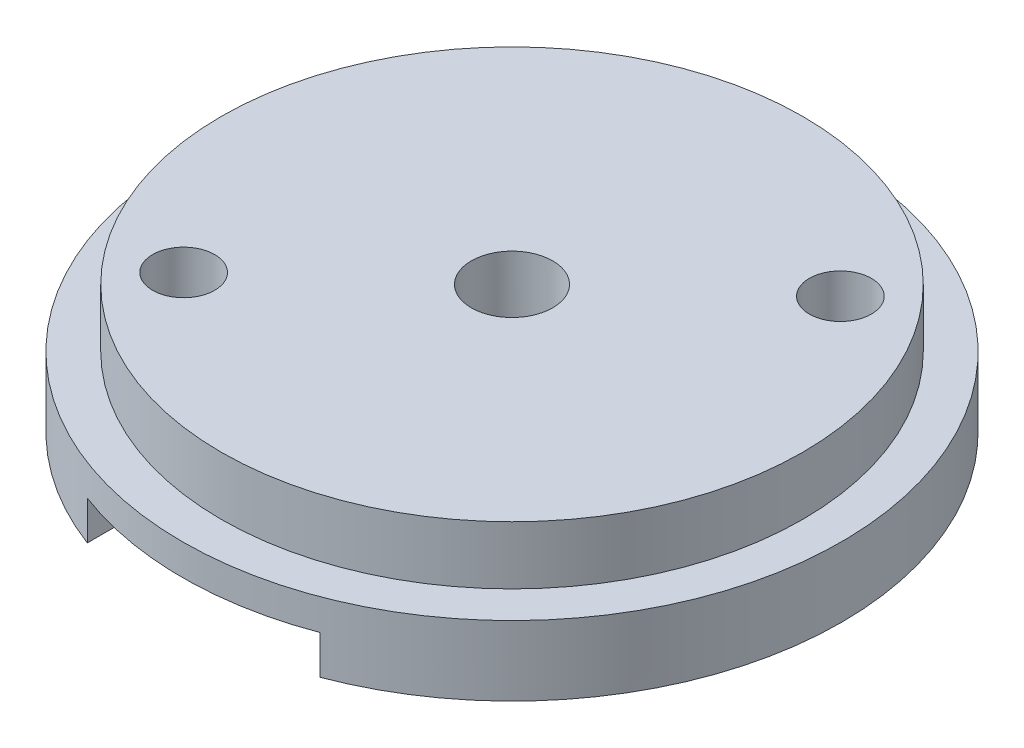
ISO-10303-21;
HEADER;
FILE_DESCRIPTION(('STEP AP214'),'2;1');
FILE_NAME('part.step','',(''),(''),'','','');
FILE_SCHEMA(('AUTOMOTIVE_DESIGN { 1 0 10303 214 1 1 1 1 }'));
ENDSEC;
DATA;
#1=APPLICATION_CONTEXT('core data for automotive mechanical design processes');
#2=APPLICATION_PROTOCOL_DEFINITION('international standard','automotive_design',2000,#1);
#3=PRODUCT_CONTEXT('',#1,'mechanical');
#4=PRODUCT('Part','Part','',(#3));
#5=PRODUCT_RELATED_PRODUCT_CATEGORY('part','',(#4));
#6=PRODUCT_DEFINITION_FORMATION('','',#4);
#7=PRODUCT_DEFINITION_CONTEXT('part definition',#1,'design');
#8=PRODUCT_DEFINITION('design','',#6,#7);
#9=PRODUCT_DEFINITION_SHAPE('','',#8);
#10=(LENGTH_UNIT() NAMED_UNIT(*) SI_UNIT(.MILLI.,.METRE.));
#11=(NAMED_UNIT(*) PLANE_ANGLE_UNIT() SI_UNIT($,.RADIAN.));
#12=(NAMED_UNIT(*) SI_UNIT($,.STERADIAN.) SOLID_ANGLE_UNIT());
#13=UNCERTAINTY_MEASURE_WITH_UNIT(LENGTH_MEASURE(1.E-05),#10,'distance_accuracy_value','');
#14=(GEOMETRIC_REPRESENTATION_CONTEXT(3) GLOBAL_UNCERTAINTY_ASSIGNED_CONTEXT((#13)) GLOBAL_UNIT_ASSIGNED_CONTEXT((#10,
#11,#12)) REPRESENTATION_CONTEXT('',''));
#15=CARTESIAN_POINT('',(0.,0.,0.));
#16=DIRECTION('',(0.,0.,1.));
#17=DIRECTION('',(1.,0.,0.));
#18=AXIS2_PLACEMENT_3D('',#15,#16,#17);
#19=CARTESIAN_POINT('',(0.,-1.6,0.));
#20=DIRECTION('',(0.,-1.,0.));
#21=DIRECTION('',(0.,0.,1.));
#22=AXIS2_PLACEMENT_3D('',#19,#20,#21);
#23=PLANE('',#22);
#24=CARTESIAN_POINT('',(0.,-1.6,0.));
#25=DIRECTION('',(0.,1.,0.));
#26=DIRECTION('',(0.,0.,1.));
#27=AXIS2_PLACEMENT_3D('',#24,#25,#26);
#28=CIRCLE('',#27,2.1);
#29=CARTESIAN_POINT('',(0.,-1.6,2.1));
#30=VERTEX_POINT('',#29);
#31=EDGE_CURVE('E113',#30,#30,#28,.T.);
#32=ORIENTED_EDGE('',*,*,#31,.T.);
#33=EDGE_LOOP('',(#32));
#34=FACE_BOUND('',#33,.T.);
#35=CARTESIAN_POINT('',(0.,-1.6,0.));
#36=DIRECTION('',(0.,1.,0.));
#37=DIRECTION('',(0.,0.,1.));
#38=AXIS2_PLACEMENT_3D('',#35,#36,#37);
#39=CIRCLE('',#38,17.);
#40=CARTESIAN_POINT('',(-6.,-1.6,15.9059737205869));
#41=VERTEX_POINT('',#40);
#42=CARTESIAN_POINT('',(6.,-1.6,15.9059737205869));
#43=VERTEX_POINT('',#42);
#44=EDGE_CURVE('E117',#41,#43,#39,.T.);
#45=ORIENTED_EDGE('',*,*,#44,.F.);
#46=DIRECTION('',(0.,0.,-1.));
#47=VECTOR('',#46,1.);
#48=CARTESIAN_POINT('',(-6.,-1.6,-15.9059737205869));
#49=LINE('',#48,#47);
#50=CARTESIAN_POINT('',(-6.,-1.6,-15.9059737205869));
#51=VERTEX_POINT('',#50);
#52=EDGE_CURVE('E92',#41,#51,#49,.T.);
#53=ORIENTED_EDGE('',*,*,#52,.T.);
#54=CARTESIAN_POINT('',(6.,-1.6,-15.9059737205869));
#55=VERTEX_POINT('',#54);
#56=EDGE_CURVE('E119',#55,#51,#39,.T.);
#57=ORIENTED_EDGE('',*,*,#56,.F.);
#58=DIRECTION('',(0.,0.,1.));
#59=VECTOR('',#58,1.);
#60=CARTESIAN_POINT('',(6.,-1.6,-15.9059737205869));
#61=LINE('',#60,#59);
#62=EDGE_CURVE('E89',#55,#43,#61,.T.);
#63=ORIENTED_EDGE('',*,*,#62,.T.);
#64=EDGE_LOOP('',(#45,#53,#57,#63));
#65=FACE_BOUND('',#64,.T.);
#66=ADVANCED_FACE('F37',(#34,#65),#23,.T.);
#67=CARTESIAN_POINT('',(0.,3.,0.));
#68=DIRECTION('',(0.,1.,0.));
#69=DIRECTION('',(0.,0.,-1.));
#70=AXIS2_PLACEMENT_3D('',#67,#68,#69);
#71=PLANE('',#70);
#72=CARTESIAN_POINT('',(9.00000000000001,3.,-7.93725393319377));
#73=DIRECTION('',(0.,1.,0.));
#74=DIRECTION('',(0.,0.,1.));
#75=AXIS2_PLACEMENT_3D('',#72,#73,#74);
#76=CIRCLE('',#75,1.6);
#77=CARTESIAN_POINT('',(9.00000000000001,3.,-6.33725393319377));
#78=VERTEX_POINT('',#77);
#79=EDGE_CURVE('E97',#78,#78,#76,.T.);
#80=ORIENTED_EDGE('',*,*,#79,.F.);
#81=EDGE_LOOP('',(#80));
#82=FACE_BOUND('',#81,.T.);
#83=CARTESIAN_POINT('',(-9.,3.,7.93725393319377));
#84=DIRECTION('',(0.,1.,0.));
#85=DIRECTION('',(0.,0.,-1.));
#86=AXIS2_PLACEMENT_3D('',#83,#84,#85);
#87=CIRCLE('',#86,1.6);
#88=CARTESIAN_POINT('',(-9.,3.,6.33725393319377));
#89=VERTEX_POINT('',#88);
#90=EDGE_CURVE('E192',#89,#89,#87,.T.);
#91=ORIENTED_EDGE('',*,*,#90,.F.);
#92=EDGE_LOOP('',(#91));
#93=FACE_BOUND('',#92,.T.);
#94=CARTESIAN_POINT('',(0.,3.,0.));
#95=DIRECTION('',(0.,-1.,0.));
#96=DIRECTION('',(0.,0.,-1.));
#97=AXIS2_PLACEMENT_3D('',#94,#95,#96);
#98=CIRCLE('',#97,15.);
#99=CARTESIAN_POINT('',(0.,3.,-15.));
#100=VERTEX_POINT('',#99);
#101=EDGE_CURVE('E11',#100,#100,#98,.T.);
#102=ORIENTED_EDGE('',*,*,#101,.F.);
#103=EDGE_LOOP('',(#102));
#104=FACE_BOUND('',#103,.T.);
#105=CARTESIAN_POINT('',(0.,3.,0.));
#106=DIRECTION('',(0.,-1.,0.));
#107=DIRECTION('',(0.,0.,-1.));
#108=AXIS2_PLACEMENT_3D('',#105,#106,#107);
#109=CIRCLE('',#108,2.1);
#110=CARTESIAN_POINT('',(0.,3.,-2.1));
#111=VERTEX_POINT('',#110);
#112=EDGE_CURVE('E46',#111,#111,#109,.T.);
#113=ORIENTED_EDGE('',*,*,#112,.T.);
#114=EDGE_LOOP('',(#113));
#115=FACE_BOUND('',#114,.T.);
#116=ADVANCED_FACE('F133',(#82,#93,#104,#115),#71,.T.);
#117=CARTESIAN_POINT('',(0.,3.,0.));
#118=DIRECTION('',(0.,-1.,0.));
#119=DIRECTION('',(0.,0.,1.));
#120=AXIS2_PLACEMENT_3D('',#117,#118,#119);
#121=CYLINDRICAL_SURFACE('',#120,15.);
#122=ORIENTED_EDGE('',*,*,#101,.T.);
#123=EDGE_LOOP('',(#122));
#124=FACE_BOUND('',#123,.T.);
#125=CARTESIAN_POINT('',(0.,0.,0.));
#126=DIRECTION('',(0.,-1.,0.));
#127=DIRECTION('',(0.,0.,-1.));
#128=AXIS2_PLACEMENT_3D('',#125,#126,#127);
#129=CIRCLE('',#128,15.);
#130=CARTESIAN_POINT('',(0.,0.,-15.));
#131=VERTEX_POINT('',#130);
#132=EDGE_CURVE('E41',#131,#131,#129,.T.);
#133=ORIENTED_EDGE('',*,*,#132,.F.);
#134=EDGE_LOOP('',(#133));
#135=FACE_BOUND('',#134,.T.);
#136=ADVANCED_FACE('F39',(#124,#135),#121,.T.);
#137=CARTESIAN_POINT('',(0.,3.,0.));
#138=DIRECTION('',(0.,-1.,0.));
#139=DIRECTION('',(0.,0.,1.));
#140=AXIS2_PLACEMENT_3D('',#137,#138,#139);
#141=CYLINDRICAL_SURFACE('',#140,2.1);
#142=ORIENTED_EDGE('',*,*,#112,.F.);
#143=EDGE_LOOP('',(#142));
#144=FACE_BOUND('',#143,.T.);
#145=ORIENTED_EDGE('',*,*,#31,.F.);
#146=EDGE_LOOP('',(#145));
#147=FACE_BOUND('',#146,.T.);
#148=ADVANCED_FACE('F132',(#144,#147),#141,.F.);
#149=CARTESIAN_POINT('',(0.,0.,0.));
#150=DIRECTION('',(0.,-1.,0.));
#151=DIRECTION('',(0.,0.,1.));
#152=AXIS2_PLACEMENT_3D('',#149,#150,#151);
#153=PLANE('',#152);
#154=ORIENTED_EDGE('',*,*,#132,.T.);
#155=EDGE_LOOP('',(#154));
#156=FACE_BOUND('',#155,.T.);
#157=CARTESIAN_POINT('',(0.,0.,0.));
#158=DIRECTION('',(0.,1.,0.));
#159=DIRECTION('',(0.,0.,1.));
#160=AXIS2_PLACEMENT_3D('',#157,#158,#159);
#161=CIRCLE('',#160,17.);
#162=CARTESIAN_POINT('',(0.,0.,17.));
#163=VERTEX_POINT('',#162);
#164=EDGE_CURVE('E116',#163,#163,#161,.T.);
#165=ORIENTED_EDGE('',*,*,#164,.T.);
#166=EDGE_LOOP('',(#165));
#167=FACE_BOUND('',#166,.T.);
#168=ADVANCED_FACE('F128',(#156,#167),#153,.F.);
#169=CARTESIAN_POINT('',(0.,-1.6,0.));
#170=DIRECTION('',(0.,1.,0.));
#171=DIRECTION('',(0.,0.,-1.));
#172=AXIS2_PLACEMENT_3D('',#169,#170,#171);
#173=CYLINDRICAL_SURFACE('',#172,17.);
#174=ORIENTED_EDGE('',*,*,#44,.T.);
#175=DIRECTION('',(0.,1.,0.));
#176=VECTOR('',#175,1.);
#177=CARTESIAN_POINT('',(6.,-3.6,15.9059737205869));
#178=LINE('',#177,#176);
#179=CARTESIAN_POINT('',(6.,-3.6,15.9059737205869));
#180=VERTEX_POINT('',#179);
#181=EDGE_CURVE('E53',#180,#43,#178,.T.);
#182=ORIENTED_EDGE('',*,*,#181,.F.);
#183=CARTESIAN_POINT('',(0.,-3.6,0.));
#184=DIRECTION('',(0.,1.,0.));
#185=DIRECTION('',(0.,0.,-1.));
#186=AXIS2_PLACEMENT_3D('',#183,#184,#185);
#187=CIRCLE('',#186,17.);
#188=CARTESIAN_POINT('',(6.,-3.6,-15.9059737205869));
#189=VERTEX_POINT('',#188);
#190=EDGE_CURVE('E85',#180,#189,#187,.T.);
#191=ORIENTED_EDGE('',*,*,#190,.T.);
#192=DIRECTION('',(0.,1.,0.));
#193=VECTOR('',#192,1.);
#194=CARTESIAN_POINT('',(6.,-3.6,-15.9059737205869));
#195=LINE('',#194,#193);
#196=EDGE_CURVE('E87',#189,#55,#195,.T.);
#197=ORIENTED_EDGE('',*,*,#196,.T.);
#198=ORIENTED_EDGE('',*,*,#56,.T.);
#199=DIRECTION('',(0.,1.,0.));
#200=VECTOR('',#199,1.);
#201=CARTESIAN_POINT('',(-6.,-3.6,-15.9059737205869));
#202=LINE('',#201,#200);
#203=CARTESIAN_POINT('',(-6.,-3.6,-15.9059737205869));
#204=VERTEX_POINT('',#203);
#205=EDGE_CURVE('E108',#204,#51,#202,.T.);
#206=ORIENTED_EDGE('',*,*,#205,.F.);
#207=CARTESIAN_POINT('',(0.,-3.6,0.));
#208=DIRECTION('',(0.,1.,0.));
#209=DIRECTION('',(0.,0.,1.));
#210=AXIS2_PLACEMENT_3D('',#207,#208,#209);
#211=CIRCLE('',#210,17.);
#212=CARTESIAN_POINT('',(-6.,-3.6,15.9059737205869));
#213=VERTEX_POINT('',#212);
#214=EDGE_CURVE('E104',#204,#213,#211,.T.);
#215=ORIENTED_EDGE('',*,*,#214,.T.);
#216=DIRECTION('',(0.,1.,0.));
#217=VECTOR('',#216,1.);
#218=CARTESIAN_POINT('',(-6.,-3.6,15.9059737205869));
#219=LINE('',#218,#217);
#220=EDGE_CURVE('E61',#213,#41,#219,.T.);
#221=ORIENTED_EDGE('',*,*,#220,.T.);
#222=EDGE_LOOP('',(#174,#182,#191,#197,#198,#206,#215,#221));
#223=FACE_BOUND('',#222,.T.);
#224=ORIENTED_EDGE('',*,*,#164,.F.);
#225=EDGE_LOOP('',(#224));
#226=FACE_BOUND('',#225,.T.);
#227=ADVANCED_FACE('F94',(#223,#226),#173,.T.);
#228=CARTESIAN_POINT('',(-6.,-3.6,-15.9059737205869));
#229=DIRECTION('',(-1.,0.,0.));
#230=DIRECTION('',(0.,0.,-1.));
#231=AXIS2_PLACEMENT_3D('',#228,#229,#230);
#232=PLANE('',#231);
#233=ORIENTED_EDGE('',*,*,#52,.F.);
#234=ORIENTED_EDGE('',*,*,#220,.F.);
#235=DIRECTION('',(0.,0.,-1.));
#236=VECTOR('',#235,1.);
#237=CARTESIAN_POINT('',(-6.,-3.6,-15.9059737205869));
#238=LINE('',#237,#236);
#239=EDGE_CURVE('E106',#213,#204,#238,.T.);
#240=ORIENTED_EDGE('',*,*,#239,.T.);
#241=ORIENTED_EDGE('',*,*,#205,.T.);
#242=EDGE_LOOP('',(#233,#234,#240,#241));
#243=FACE_BOUND('',#242,.T.);
#244=ADVANCED_FACE('F150',(#243),#232,.F.);
#245=CARTESIAN_POINT('',(0.,-3.6,0.));
#246=DIRECTION('',(0.,-1.,0.));
#247=DIRECTION('',(0.,0.,1.));
#248=AXIS2_PLACEMENT_3D('',#245,#246,#247);
#249=PLANE('',#248);
#250=CARTESIAN_POINT('',(-9.,-3.6,7.93725393319377));
#251=DIRECTION('',(0.,1.,0.));
#252=DIRECTION('',(0.,0.,-1.));
#253=AXIS2_PLACEMENT_3D('',#250,#251,#252);
#254=CIRCLE('',#253,1.6);
#255=CARTESIAN_POINT('',(-9.,-3.6,6.33725393319377));
#256=VERTEX_POINT('',#255);
#257=EDGE_CURVE('E100',#256,#256,#254,.T.);
#258=ORIENTED_EDGE('',*,*,#257,.T.);
#259=EDGE_LOOP('',(#258));
#260=FACE_BOUND('',#259,.T.);
#261=ORIENTED_EDGE('',*,*,#214,.F.);
#262=ORIENTED_EDGE('',*,*,#239,.F.);
#263=EDGE_LOOP('',(#261,#262));
#264=FACE_BOUND('',#263,.T.);
#265=ADVANCED_FACE('F158',(#260,#264),#249,.T.);
#266=CARTESIAN_POINT('',(6.,-3.6,-15.9059737205869));
#267=DIRECTION('',(1.,0.,0.));
#268=DIRECTION('',(0.,0.,1.));
#269=AXIS2_PLACEMENT_3D('',#266,#267,#268);
#270=PLANE('',#269);
#271=ORIENTED_EDGE('',*,*,#62,.F.);
#272=ORIENTED_EDGE('',*,*,#196,.F.);
#273=DIRECTION('',(0.,0.,1.));
#274=VECTOR('',#273,1.);
#275=CARTESIAN_POINT('',(6.,-3.6,-15.9059737205869));
#276=LINE('',#275,#274);
#277=EDGE_CURVE('E81',#189,#180,#276,.T.);
#278=ORIENTED_EDGE('',*,*,#277,.T.);
#279=ORIENTED_EDGE('',*,*,#181,.T.);
#280=EDGE_LOOP('',(#271,#272,#278,#279));
#281=FACE_BOUND('',#280,.T.);
#282=ADVANCED_FACE('F88',(#281),#270,.F.);
#283=CARTESIAN_POINT('',(0.,-3.6,0.));
#284=DIRECTION('',(0.,1.,0.));
#285=DIRECTION('',(0.,0.,-1.));
#286=AXIS2_PLACEMENT_3D('',#283,#284,#285);
#287=PLANE('',#286);
#288=CARTESIAN_POINT('',(9.00000000000001,-3.6,-7.93725393319377));
#289=DIRECTION('',(0.,1.,0.));
#290=DIRECTION('',(0.,0.,1.));
#291=AXIS2_PLACEMENT_3D('',#288,#289,#290);
#292=CIRCLE('',#291,1.6);
#293=CARTESIAN_POINT('',(9.00000000000001,-3.6,-6.33725393319377));
#294=VERTEX_POINT('',#293);
#295=EDGE_CURVE('E191',#294,#294,#292,.T.);
#296=ORIENTED_EDGE('',*,*,#295,.T.);
#297=EDGE_LOOP('',(#296));
#298=FACE_BOUND('',#297,.T.);
#299=ORIENTED_EDGE('',*,*,#190,.F.);
#300=ORIENTED_EDGE('',*,*,#277,.F.);
#301=EDGE_LOOP('',(#299,#300));
#302=FACE_BOUND('',#301,.T.);
#303=ADVANCED_FACE('F83',(#298,#302),#287,.F.);
#304=CARTESIAN_POINT('',(9.00000000000001,3.,-7.93725393319377));
#305=DIRECTION('',(0.,-1.,0.));
#306=DIRECTION('',(0.,0.,1.));
#307=AXIS2_PLACEMENT_3D('',#304,#305,#306);
#308=CYLINDRICAL_SURFACE('',#307,1.6);
#309=ORIENTED_EDGE('',*,*,#79,.T.);
#310=EDGE_LOOP('',(#309));
#311=FACE_BOUND('',#310,.T.);
#312=ORIENTED_EDGE('',*,*,#295,.F.);
#313=EDGE_LOOP('',(#312));
#314=FACE_BOUND('',#313,.T.);
#315=ADVANCED_FACE('F176',(#311,#314),#308,.F.);
#316=CARTESIAN_POINT('',(-9.,3.,7.93725393319377));
#317=DIRECTION('',(0.,-1.,0.));
#318=DIRECTION('',(0.,0.,1.));
#319=AXIS2_PLACEMENT_3D('',#316,#317,#318);
#320=CYLINDRICAL_SURFACE('',#319,1.6);
#321=ORIENTED_EDGE('',*,*,#90,.T.);
#322=EDGE_LOOP('',(#321));
#323=FACE_BOUND('',#322,.T.);
#324=ORIENTED_EDGE('',*,*,#257,.F.);
#325=EDGE_LOOP('',(#324));
#326=FACE_BOUND('',#325,.T.);
#327=ADVANCED_FACE('F178',(#323,#326),#320,.F.);
#328=CLOSED_SHELL('',(#66,#116,#136,#148,#168,#227,#244,#265,#282,#303,#315,#327));
#329=MANIFOLD_SOLID_BREP('B2',#328);
#330=ADVANCED_BREP_SHAPE_REPRESENTATION('',(#18,#329),#14);
#331=SHAPE_DEFINITION_REPRESENTATION(#9,#330);
ENDSEC;
END-ISO-10303-21;
